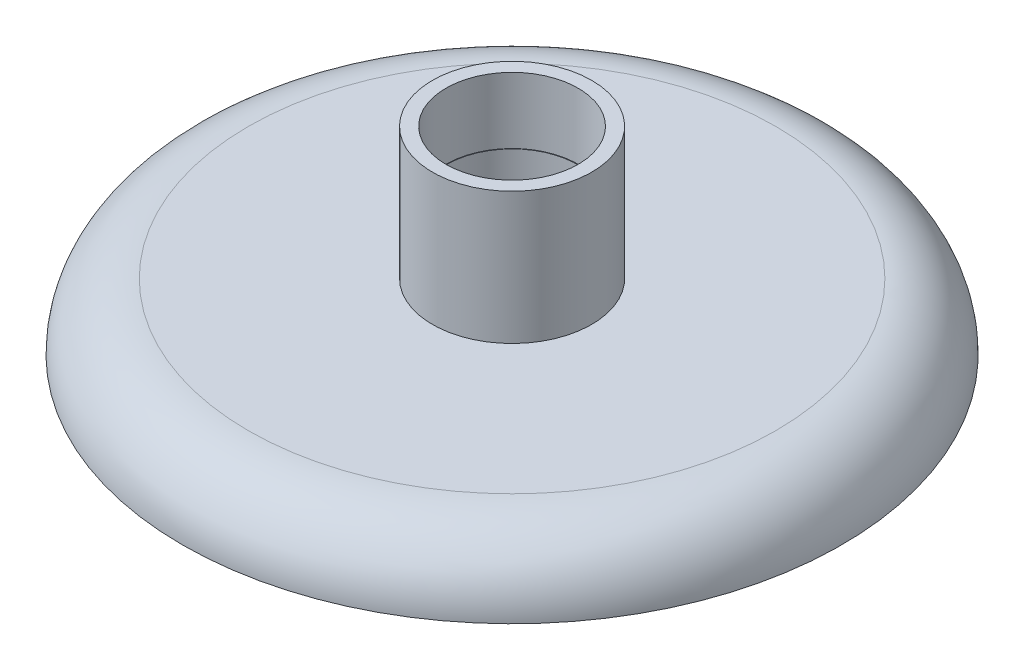
ISO-10303-21;
HEADER;
FILE_DESCRIPTION(('STEP AP214'),'2;1');
FILE_NAME('part.step','',(''),(''),'','','');
FILE_SCHEMA(('AUTOMOTIVE_DESIGN { 1 0 10303 214 1 1 1 1 }'));
ENDSEC;
DATA;
#1=APPLICATION_CONTEXT('core data for automotive mechanical design processes');
#2=APPLICATION_PROTOCOL_DEFINITION('international standard','automotive_design',2000,#1);
#3=PRODUCT_CONTEXT('',#1,'mechanical');
#4=PRODUCT('Part','Part','',(#3));
#5=PRODUCT_RELATED_PRODUCT_CATEGORY('part','',(#4));
#6=PRODUCT_DEFINITION_FORMATION('','',#4);
#7=PRODUCT_DEFINITION_CONTEXT('part definition',#1,'design');
#8=PRODUCT_DEFINITION('design','',#6,#7);
#9=PRODUCT_DEFINITION_SHAPE('','',#8);
#10=(LENGTH_UNIT() NAMED_UNIT(*) SI_UNIT(.MILLI.,.METRE.));
#11=(NAMED_UNIT(*) PLANE_ANGLE_UNIT() SI_UNIT($,.RADIAN.));
#12=(NAMED_UNIT(*) SI_UNIT($,.STERADIAN.) SOLID_ANGLE_UNIT());
#13=UNCERTAINTY_MEASURE_WITH_UNIT(LENGTH_MEASURE(1.E-05),#10,'distance_accuracy_value','');
#14=(GEOMETRIC_REPRESENTATION_CONTEXT(3) GLOBAL_UNCERTAINTY_ASSIGNED_CONTEXT((#13)) GLOBAL_UNIT_ASSIGNED_CONTEXT((#10,
#11,#12)) REPRESENTATION_CONTEXT('',''));
#15=CARTESIAN_POINT('',(0.,0.,0.));
#16=DIRECTION('',(0.,0.,1.));
#17=DIRECTION('',(1.,0.,0.));
#18=AXIS2_PLACEMENT_3D('',#15,#16,#17);
#19=CARTESIAN_POINT('',(0.,27.94,0.));
#20=DIRECTION('',(0.,-1.,0.));
#21=DIRECTION('',(0.,0.,-1.));
#22=AXIS2_PLACEMENT_3D('',#19,#20,#21);
#23=CYLINDRICAL_SURFACE('',#22,12.6202094953075);
#24=CARTESIAN_POINT('',(0.,12.7,0.));
#25=DIRECTION('',(0.,1.,0.));
#26=DIRECTION('',(0.,0.,1.));
#27=AXIS2_PLACEMENT_3D('',#24,#25,#26);
#28=CIRCLE('',#27,12.6202094953075);
#29=CARTESIAN_POINT('',(0.,12.7,12.6202094953075));
#30=VERTEX_POINT('',#29);
#31=EDGE_CURVE('E56',#30,#30,#28,.F.);
#32=ORIENTED_EDGE('',*,*,#31,.T.);
#33=EDGE_LOOP('',(#32));
#34=FACE_BOUND('',#33,.T.);
#35=CARTESIAN_POINT('',(0.,25.4,0.));
#36=DIRECTION('',(0.,1.,0.));
#37=DIRECTION('',(0.,0.,1.));
#38=AXIS2_PLACEMENT_3D('',#35,#36,#37);
#39=CIRCLE('',#38,12.6202094953075);
#40=CARTESIAN_POINT('',(0.,25.4,12.6202094953075));
#41=VERTEX_POINT('',#40);
#42=EDGE_CURVE('E39',#41,#41,#39,.T.);
#43=ORIENTED_EDGE('',*,*,#42,.T.);
#44=EDGE_LOOP('',(#43));
#45=FACE_BOUND('',#44,.T.);
#46=ADVANCED_FACE('F35',(#34,#45),#23,.F.);
#47=CARTESIAN_POINT('',(0.,12.7,0.));
#48=DIRECTION('',(0.,1.,0.));
#49=DIRECTION('',(0.,0.,1.));
#50=AXIS2_PLACEMENT_3D('',#47,#48,#49);
#51=PLANE('',#50);
#52=CARTESIAN_POINT('',(0.,12.7,0.));
#53=DIRECTION('',(0.,1.,0.));
#54=DIRECTION('',(0.,0.,1.));
#55=AXIS2_PLACEMENT_3D('',#52,#53,#54);
#56=CIRCLE('',#55,15.3312224225322);
#57=CARTESIAN_POINT('',(0.,12.7,-15.3312224225322));
#58=VERTEX_POINT('',#57);
#59=EDGE_CURVE('E58',#58,#58,#56,.T.);
#60=ORIENTED_EDGE('',*,*,#59,.F.);
#61=EDGE_LOOP('',(#60));
#62=FACE_BOUND('',#61,.T.);
#63=CARTESIAN_POINT('',(0.,12.7,0.));
#64=DIRECTION('',(0.,1.,0.));
#65=DIRECTION('',(0.,0.,1.));
#66=AXIS2_PLACEMENT_3D('',#63,#64,#65);
#67=CIRCLE('',#66,50.7753133814132);
#68=CARTESIAN_POINT('',(0.,12.7,50.7753133814132));
#69=VERTEX_POINT('',#68);
#70=EDGE_CURVE('E10',#69,#69,#67,.T.);
#71=ORIENTED_EDGE('',*,*,#70,.T.);
#72=EDGE_LOOP('',(#71));
#73=FACE_BOUND('',#72,.T.);
#74=ADVANCED_FACE('F105',(#62,#73),#51,.T.);
#75=CARTESIAN_POINT('',(0.,0.,0.));
#76=DIRECTION('',(0.,1.,0.));
#77=DIRECTION('',(0.,0.,1.));
#78=AXIS2_PLACEMENT_3D('',#75,#76,#77);
#79=PLANE('',#78);
#80=CARTESIAN_POINT('',(0.,0.,0.));
#81=DIRECTION('',(0.,1.,0.));
#82=DIRECTION('',(0.,0.,1.));
#83=AXIS2_PLACEMENT_3D('',#80,#81,#82);
#84=CIRCLE('',#83,57.1253133814132);
#85=CARTESIAN_POINT('',(0.,0.,57.1253133814132));
#86=VERTEX_POINT('',#85);
#87=EDGE_CURVE('E54',#86,#86,#84,.T.);
#88=ORIENTED_EDGE('',*,*,#87,.T.);
#89=EDGE_LOOP('',(#88));
#90=FACE_BOUND('',#89,.T.);
#91=CARTESIAN_POINT('',(0.,0.,0.));
#92=DIRECTION('',(0.,1.,0.));
#93=DIRECTION('',(0.,0.,1.));
#94=AXIS2_PLACEMENT_3D('',#91,#92,#93);
#95=CIRCLE('',#94,63.4753133814132);
#96=CARTESIAN_POINT('',(0.,0.,63.4753133814132));
#97=VERTEX_POINT('',#96);
#98=EDGE_CURVE('E43',#97,#97,#95,.T.);
#99=ORIENTED_EDGE('',*,*,#98,.F.);
#100=EDGE_LOOP('',(#99));
#101=FACE_BOUND('',#100,.T.);
#102=ADVANCED_FACE('F84',(#90,#101),#79,.F.);
#103=CARTESIAN_POINT('',(0.,0.,0.));
#104=DIRECTION('',(0.,1.,0.));
#105=DIRECTION('',(0.,0.,1.));
#106=AXIS2_PLACEMENT_3D('',#103,#104,#105);
#107=TOROIDAL_SURFACE('',#106,50.7753133814132,12.7);
#108=ORIENTED_EDGE('',*,*,#98,.T.);
#109=EDGE_LOOP('',(#108));
#110=FACE_BOUND('',#109,.T.);
#111=ORIENTED_EDGE('',*,*,#70,.F.);
#112=EDGE_LOOP('',(#111));
#113=FACE_BOUND('',#112,.T.);
#114=ADVANCED_FACE('F37',(#110,#113),#107,.T.);
#115=CARTESIAN_POINT('',(0.,6.35,0.));
#116=DIRECTION('',(0.,1.,0.));
#117=DIRECTION('',(0.,0.,1.));
#118=AXIS2_PLACEMENT_3D('',#115,#116,#117);
#119=PLANE('',#118);
#120=CARTESIAN_POINT('',(0.,6.35,0.));
#121=DIRECTION('',(0.,1.,0.));
#122=DIRECTION('',(0.,0.,1.));
#123=AXIS2_PLACEMENT_3D('',#120,#121,#122);
#124=CIRCLE('',#123,12.710048883822);
#125=CARTESIAN_POINT('',(0.,6.35,12.710048883822));
#126=VERTEX_POINT('',#125);
#127=EDGE_CURVE('E52',#126,#126,#124,.F.);
#128=ORIENTED_EDGE('',*,*,#127,.F.);
#129=EDGE_LOOP('',(#128));
#130=FACE_BOUND('',#129,.T.);
#131=CARTESIAN_POINT('',(0.,6.35,0.));
#132=DIRECTION('',(0.,1.,0.));
#133=DIRECTION('',(0.,0.,1.));
#134=AXIS2_PLACEMENT_3D('',#131,#132,#133);
#135=CIRCLE('',#134,50.7753133814132);
#136=CARTESIAN_POINT('',(0.,6.35,50.7753133814132));
#137=VERTEX_POINT('',#136);
#138=EDGE_CURVE('E48',#137,#137,#135,.T.);
#139=ORIENTED_EDGE('',*,*,#138,.F.);
#140=EDGE_LOOP('',(#139));
#141=FACE_BOUND('',#140,.T.);
#142=ADVANCED_FACE('F91',(#130,#141),#119,.F.);
#143=CARTESIAN_POINT('',(0.,0.,0.));
#144=DIRECTION('',(0.,1.,0.));
#145=DIRECTION('',(0.,0.,1.));
#146=AXIS2_PLACEMENT_3D('',#143,#144,#145);
#147=TOROIDAL_SURFACE('',#146,50.7753133814132,6.35);
#148=ORIENTED_EDGE('',*,*,#87,.F.);
#149=EDGE_LOOP('',(#148));
#150=FACE_BOUND('',#149,.T.);
#151=ORIENTED_EDGE('',*,*,#138,.T.);
#152=EDGE_LOOP('',(#151));
#153=FACE_BOUND('',#152,.T.);
#154=ADVANCED_FACE('F87',(#150,#153),#147,.F.);
#155=CARTESIAN_POINT('',(0.,12.7,0.));
#156=DIRECTION('',(0.,-1.,0.));
#157=DIRECTION('',(0.,0.,-1.));
#158=AXIS2_PLACEMENT_3D('',#155,#156,#157);
#159=CYLINDRICAL_SURFACE('',#158,12.710048883822);
#160=CARTESIAN_POINT('',(0.,12.7,0.));
#161=DIRECTION('',(0.,1.,0.));
#162=DIRECTION('',(0.,0.,1.));
#163=AXIS2_PLACEMENT_3D('',#160,#161,#162);
#164=CIRCLE('',#163,12.710048883822);
#165=CARTESIAN_POINT('',(0.,12.7,12.710048883822));
#166=VERTEX_POINT('',#165);
#167=EDGE_CURVE('E55',#166,#166,#164,.T.);
#168=ORIENTED_EDGE('',*,*,#167,.T.);
#169=EDGE_LOOP('',(#168));
#170=FACE_BOUND('',#169,.T.);
#171=ORIENTED_EDGE('',*,*,#127,.T.);
#172=EDGE_LOOP('',(#171));
#173=FACE_BOUND('',#172,.T.);
#174=ADVANCED_FACE('F90',(#170,#173),#159,.F.);
#175=CARTESIAN_POINT('',(0.,12.7,0.));
#176=DIRECTION('',(0.,1.,0.));
#177=DIRECTION('',(0.,0.,1.));
#178=AXIS2_PLACEMENT_3D('',#175,#176,#177);
#179=PLANE('',#178);
#180=ORIENTED_EDGE('',*,*,#31,.F.);
#181=EDGE_LOOP('',(#180));
#182=FACE_BOUND('',#181,.T.);
#183=ORIENTED_EDGE('',*,*,#167,.F.);
#184=EDGE_LOOP('',(#183));
#185=FACE_BOUND('',#184,.T.);
#186=ADVANCED_FACE('F121',(#182,#185),#179,.F.);
#187=CARTESIAN_POINT('',(0.,38.1,0.));
#188=DIRECTION('',(0.,-1.,0.));
#189=DIRECTION('',(0.,0.,-1.));
#190=AXIS2_PLACEMENT_3D('',#187,#188,#189);
#191=CYLINDRICAL_SURFACE('',#190,15.3312224225322);
#192=CARTESIAN_POINT('',(0.,38.1,0.));
#193=DIRECTION('',(0.,1.,0.));
#194=DIRECTION('',(0.,0.,1.));
#195=AXIS2_PLACEMENT_3D('',#192,#193,#194);
#196=CIRCLE('',#195,15.3312224225322);
#197=CARTESIAN_POINT('',(0.,38.1,-15.3312224225322));
#198=VERTEX_POINT('',#197);
#199=EDGE_CURVE('E62',#198,#198,#196,.T.);
#200=CARTESIAN_POINT('',(0.,38.1,-15.3312224225322));
#201=CARTESIAN_POINT('',(0.,37.8354166666667,-15.3312224225322));
#202=CARTESIAN_POINT('',(0.,37.5708333333333,-15.3312224225322));
#203=CARTESIAN_POINT('',(0.,37.0416666666667,-15.3312224225322));
#204=CARTESIAN_POINT('',(0.,36.7770833333333,-15.3312224225322));
#205=CARTESIAN_POINT('',(0.,36.2479166666667,-15.3312224225322));
#206=CARTESIAN_POINT('',(0.,35.9833333333333,-15.3312224225322));
#207=CARTESIAN_POINT('',(0.,35.4541666666667,-15.3312224225322));
#208=CARTESIAN_POINT('',(0.,35.1895833333333,-15.3312224225322));
#209=CARTESIAN_POINT('',(0.,34.6604166666667,-15.3312224225322));
#210=CARTESIAN_POINT('',(0.,34.3958333333333,-15.3312224225322));
#211=CARTESIAN_POINT('',(0.,33.8666666666667,-15.3312224225322));
#212=CARTESIAN_POINT('',(0.,33.6020833333333,-15.3312224225322));
#213=CARTESIAN_POINT('',(0.,33.0729166666667,-15.3312224225322));
#214=CARTESIAN_POINT('',(0.,32.8083333333333,-15.3312224225322));
#215=CARTESIAN_POINT('',(0.,32.2791666666667,-15.3312224225322));
#216=CARTESIAN_POINT('',(0.,32.0145833333333,-15.3312224225322));
#217=CARTESIAN_POINT('',(0.,31.4854166666667,-15.3312224225322));
#218=CARTESIAN_POINT('',(0.,31.2208333333333,-15.3312224225322));
#219=CARTESIAN_POINT('',(0.,30.6916666666667,-15.3312224225322));
#220=CARTESIAN_POINT('',(0.,30.4270833333333,-15.3312224225322));
#221=CARTESIAN_POINT('',(0.,29.8979166666667,-15.3312224225322));
#222=CARTESIAN_POINT('',(0.,29.6333333333333,-15.3312224225322));
#223=CARTESIAN_POINT('',(0.,29.1041666666667,-15.3312224225322));
#224=CARTESIAN_POINT('',(0.,28.8395833333333,-15.3312224225322));
#225=CARTESIAN_POINT('',(0.,28.3104166666667,-15.3312224225322));
#226=CARTESIAN_POINT('',(0.,28.0458333333333,-15.3312224225322));
#227=CARTESIAN_POINT('',(0.,27.5166666666667,-15.3312224225322));
#228=CARTESIAN_POINT('',(0.,27.2520833333333,-15.3312224225322));
#229=CARTESIAN_POINT('',(0.,26.7229166666667,-15.3312224225322));
#230=CARTESIAN_POINT('',(0.,26.4583333333333,-15.3312224225322));
#231=CARTESIAN_POINT('',(0.,25.9291666666667,-15.3312224225322));
#232=CARTESIAN_POINT('',(0.,25.6645833333333,-15.3312224225322));
#233=CARTESIAN_POINT('',(0.,25.1354166666667,-15.3312224225322));
#234=CARTESIAN_POINT('',(0.,24.8708333333333,-15.3312224225322));
#235=CARTESIAN_POINT('',(0.,24.3416666666667,-15.3312224225322));
#236=CARTESIAN_POINT('',(0.,24.0770833333333,-15.3312224225322));
#237=CARTESIAN_POINT('',(0.,23.5479166666667,-15.3312224225322));
#238=CARTESIAN_POINT('',(0.,23.2833333333333,-15.3312224225322));
#239=CARTESIAN_POINT('',(0.,22.7541666666667,-15.3312224225322));
#240=CARTESIAN_POINT('',(0.,22.4895833333333,-15.3312224225322));
#241=CARTESIAN_POINT('',(0.,21.9604166666667,-15.3312224225322));
#242=CARTESIAN_POINT('',(0.,21.6958333333333,-15.3312224225322));
#243=CARTESIAN_POINT('',(0.,21.1666666666667,-15.3312224225322));
#244=CARTESIAN_POINT('',(0.,20.9020833333333,-15.3312224225322));
#245=CARTESIAN_POINT('',(0.,20.3729166666667,-15.3312224225322));
#246=CARTESIAN_POINT('',(0.,20.1083333333333,-15.3312224225322));
#247=CARTESIAN_POINT('',(0.,19.5791666666667,-15.3312224225322));
#248=CARTESIAN_POINT('',(0.,19.3145833333333,-15.3312224225322));
#249=CARTESIAN_POINT('',(0.,18.7854166666667,-15.3312224225322));
#250=CARTESIAN_POINT('',(0.,18.5208333333333,-15.3312224225322));
#251=CARTESIAN_POINT('',(0.,17.9916666666667,-15.3312224225322));
#252=CARTESIAN_POINT('',(0.,17.7270833333333,-15.3312224225322));
#253=CARTESIAN_POINT('',(0.,17.1979166666667,-15.3312224225322));
#254=CARTESIAN_POINT('',(0.,16.9333333333333,-15.3312224225322));
#255=CARTESIAN_POINT('',(0.,16.4041666666667,-15.3312224225322));
#256=CARTESIAN_POINT('',(0.,16.1395833333333,-15.3312224225322));
#257=CARTESIAN_POINT('',(0.,15.6104166666667,-15.3312224225322));
#258=CARTESIAN_POINT('',(0.,15.3458333333333,-15.3312224225322));
#259=CARTESIAN_POINT('',(0.,14.8166666666667,-15.3312224225322));
#260=CARTESIAN_POINT('',(0.,14.5520833333333,-15.3312224225322));
#261=CARTESIAN_POINT('',(0.,14.0229166666667,-15.3312224225322));
#262=CARTESIAN_POINT('',(0.,13.7583333333333,-15.3312224225322));
#263=CARTESIAN_POINT('',(0.,13.2291666666667,-15.3312224225322));
#264=CARTESIAN_POINT('',(0.,12.9645833333333,-15.3312224225322));
#265=CARTESIAN_POINT('',(0.,12.7,-15.3312224225322));
#266=B_SPLINE_CURVE_WITH_KNOTS('',3,(#200,#201,#202,#203,#204,#205,#206,#207,#208,#209,#210,
#211,#212,#213,#214,#215,#216,#217,#218,#219,#220,#221,#222,#223,#224,#225,#226,#227,#228,#229,
#230,#231,#232,#233,#234,#235,#236,#237,#238,#239,#240,#241,#242,#243,#244,#245,#246,#247,#248,
#249,#250,#251,#252,#253,#254,#255,#256,#257,#258,#259,#260,#261,#262,#263,#264,#265),
.UNSPECIFIED.,.F.,.F.,(4,2,2,2,2,2,2,2,2,2,2,2,2,2,2,2,2,2,2,2,2,2,2,2,2,2,2,2,2,2,2,2,4),(0.,
0.793749999999996,1.5875,2.38124999999999,3.175,3.96874999999999,4.7625,5.55625,
6.34999999999999,7.14375,7.93749999999999,8.73125,9.525,10.31875,11.1125,11.90625,12.7,13.49375,
14.2875,15.08125,15.875,16.66875,17.4625,18.25625,19.05,19.84375,20.6375,21.43125,22.225,
23.01875,23.8125,24.60625,25.4),.UNSPECIFIED.);
#267=EDGE_CURVE('BSEAM119',#198,#58,#266,.T.);
#268=ORIENTED_EDGE('',*,*,#199,.F.);
#269=ORIENTED_EDGE('',*,*,#59,.T.);
#270=ORIENTED_EDGE('',*,*,#267,.T.);
#271=ORIENTED_EDGE('',*,*,#267,.F.);
#272=EDGE_LOOP('',(#268,#270,#269,#271));
#273=FACE_BOUND('',#272,.T.);
#274=ADVANCED_FACE('F119',(#273),#191,.T.);
#275=CARTESIAN_POINT('',(0.,38.1,0.));
#276=DIRECTION('',(0.,1.,0.));
#277=DIRECTION('',(0.,0.,1.));
#278=AXIS2_PLACEMENT_3D('',#275,#276,#277);
#279=PLANE('',#278);
#280=CARTESIAN_POINT('',(0.,38.1,0.));
#281=DIRECTION('',(0.,1.,0.));
#282=DIRECTION('',(0.,0.,1.));
#283=AXIS2_PLACEMENT_3D('',#280,#281,#282);
#284=CIRCLE('',#283,12.7236423876779);
#285=CARTESIAN_POINT('',(0.,38.1,12.7236423876779));
#286=VERTEX_POINT('',#285);
#287=EDGE_CURVE('E69',#286,#286,#284,.T.);
#288=ORIENTED_EDGE('',*,*,#287,.F.);
#289=EDGE_LOOP('',(#288));
#290=FACE_BOUND('',#289,.T.);
#291=ORIENTED_EDGE('',*,*,#199,.T.);
#292=EDGE_LOOP('',(#291));
#293=FACE_BOUND('',#292,.T.);
#294=ADVANCED_FACE('F116',(#290,#293),#279,.T.);
#295=CARTESIAN_POINT('',(0.,25.4,0.));
#296=DIRECTION('',(0.,1.,0.));
#297=DIRECTION('',(0.,0.,1.));
#298=AXIS2_PLACEMENT_3D('',#295,#296,#297);
#299=CYLINDRICAL_SURFACE('',#298,12.7236423876779);
#300=CARTESIAN_POINT('',(0.,25.4,0.));
#301=DIRECTION('',(0.,1.,0.));
#302=DIRECTION('',(0.,0.,1.));
#303=AXIS2_PLACEMENT_3D('',#300,#301,#302);
#304=CIRCLE('',#303,12.7236423876779);
#305=CARTESIAN_POINT('',(0.,25.4,12.7236423876779));
#306=VERTEX_POINT('',#305);
#307=EDGE_CURVE('E65',#306,#306,#304,.T.);
#308=ORIENTED_EDGE('',*,*,#307,.F.);
#309=EDGE_LOOP('',(#308));
#310=FACE_BOUND('',#309,.T.);
#311=ORIENTED_EDGE('',*,*,#287,.T.);
#312=EDGE_LOOP('',(#311));
#313=FACE_BOUND('',#312,.T.);
#314=ADVANCED_FACE('F114',(#310,#313),#299,.F.);
#315=CARTESIAN_POINT('',(0.,25.4,0.));
#316=DIRECTION('',(0.,1.,0.));
#317=DIRECTION('',(0.,0.,1.));
#318=AXIS2_PLACEMENT_3D('',#315,#316,#317);
#319=PLANE('',#318);
#320=ORIENTED_EDGE('',*,*,#42,.F.);
#321=EDGE_LOOP('',(#320));
#322=FACE_BOUND('',#321,.T.);
#323=ORIENTED_EDGE('',*,*,#307,.T.);
#324=EDGE_LOOP('',(#323));
#325=FACE_BOUND('',#324,.T.);
#326=ADVANCED_FACE('F155',(#322,#325),#319,.T.);
#327=CLOSED_SHELL('',(#46,#74,#102,#114,#142,#154,#174,#186,#274,#294,#314,#326));
#328=MANIFOLD_SOLID_BREP('B2',#327);
#329=ADVANCED_BREP_SHAPE_REPRESENTATION('',(#18,#328),#14);
#330=SHAPE_DEFINITION_REPRESENTATION(#9,#329);
ENDSEC;
END-ISO-10303-21;
